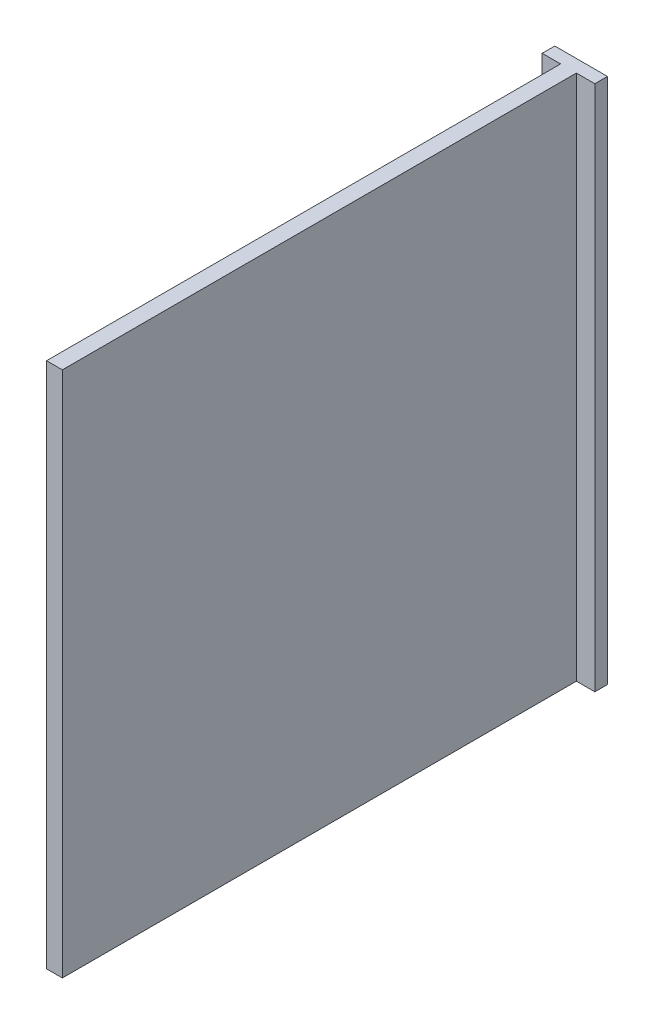
ISO-10303-21;
HEADER;
FILE_DESCRIPTION(('STEP AP214'),'2;1');
FILE_NAME('part.step','',(''),(''),'','','');
FILE_SCHEMA(('AUTOMOTIVE_DESIGN { 1 0 10303 214 1 1 1 1 }'));
ENDSEC;
DATA;
#1=APPLICATION_CONTEXT('core data for automotive mechanical design processes');
#2=APPLICATION_PROTOCOL_DEFINITION('international standard','automotive_design',2000,#1);
#3=PRODUCT_CONTEXT('',#1,'mechanical');
#4=PRODUCT('Part','Part','',(#3));
#5=PRODUCT_RELATED_PRODUCT_CATEGORY('part','',(#4));
#6=PRODUCT_DEFINITION_FORMATION('','',#4);
#7=PRODUCT_DEFINITION_CONTEXT('part definition',#1,'design');
#8=PRODUCT_DEFINITION('design','',#6,#7);
#9=PRODUCT_DEFINITION_SHAPE('','',#8);
#10=(LENGTH_UNIT() NAMED_UNIT(*) SI_UNIT(.MILLI.,.METRE.));
#11=(NAMED_UNIT(*) PLANE_ANGLE_UNIT() SI_UNIT($,.RADIAN.));
#12=(NAMED_UNIT(*) SI_UNIT($,.STERADIAN.) SOLID_ANGLE_UNIT());
#13=UNCERTAINTY_MEASURE_WITH_UNIT(LENGTH_MEASURE(1.E-05),#10,'distance_accuracy_value','');
#14=(GEOMETRIC_REPRESENTATION_CONTEXT(3) GLOBAL_UNCERTAINTY_ASSIGNED_CONTEXT((#13)) GLOBAL_UNIT_ASSIGNED_CONTEXT((#10,
#11,#12)) REPRESENTATION_CONTEXT('',''));
#15=CARTESIAN_POINT('',(0.,0.,0.));
#16=DIRECTION('',(0.,0.,1.));
#17=DIRECTION('',(1.,0.,0.));
#18=AXIS2_PLACEMENT_3D('',#15,#16,#17);
#19=CARTESIAN_POINT('',(1.25,25.,0.));
#20=DIRECTION('',(-1.,0.,0.));
#21=DIRECTION('',(0.,0.,1.));
#22=AXIS2_PLACEMENT_3D('',#19,#20,#21);
#23=PLANE('',#22);
#24=DIRECTION('',(0.,0.,-1.));
#25=VECTOR('',#24,1.);
#26=CARTESIAN_POINT('',(1.25,0.,0.));
#27=LINE('',#26,#25);
#28=CARTESIAN_POINT('',(1.25,0.,0.6));
#29=VERTEX_POINT('',#28);
#30=CARTESIAN_POINT('',(1.25,0.,0.));
#31=VERTEX_POINT('',#30);
#32=EDGE_CURVE('E146',#29,#31,#27,.T.);
#33=ORIENTED_EDGE('',*,*,#32,.T.);
#34=DIRECTION('',(0.,-1.,0.));
#35=VECTOR('',#34,1.);
#36=CARTESIAN_POINT('',(1.25,25.,0.));
#37=LINE('',#36,#35);
#38=CARTESIAN_POINT('',(1.25,25.,0.));
#39=VERTEX_POINT('',#38);
#40=EDGE_CURVE('E11',#39,#31,#37,.T.);
#41=ORIENTED_EDGE('',*,*,#40,.F.);
#42=DIRECTION('',(0.,0.,-1.));
#43=VECTOR('',#42,1.);
#44=CARTESIAN_POINT('',(1.25,25.,0.));
#45=LINE('',#44,#43);
#46=CARTESIAN_POINT('',(1.25,25.,0.6));
#47=VERTEX_POINT('',#46);
#48=EDGE_CURVE('E168',#47,#39,#45,.T.);
#49=ORIENTED_EDGE('',*,*,#48,.F.);
#50=DIRECTION('',(0.,-1.,0.));
#51=VECTOR('',#50,1.);
#52=CARTESIAN_POINT('',(1.25,25.,0.6));
#53=LINE('',#52,#51);
#54=EDGE_CURVE('E142',#47,#29,#53,.T.);
#55=ORIENTED_EDGE('',*,*,#54,.T.);
#56=EDGE_LOOP('',(#33,#41,#49,#55));
#57=FACE_BOUND('',#56,.T.);
#58=ADVANCED_FACE('F45',(#57),#23,.F.);
#59=CARTESIAN_POINT('',(-1.25,25.,0.));
#60=DIRECTION('',(0.,0.,1.));
#61=DIRECTION('',(1.,0.,0.));
#62=AXIS2_PLACEMENT_3D('',#59,#60,#61);
#63=PLANE('',#62);
#64=DIRECTION('',(-1.,0.,0.));
#65=VECTOR('',#64,1.);
#66=CARTESIAN_POINT('',(-1.25,0.,0.));
#67=LINE('',#66,#65);
#68=CARTESIAN_POINT('',(-1.25,0.,0.));
#69=VERTEX_POINT('',#68);
#70=EDGE_CURVE('E150',#31,#69,#67,.T.);
#71=ORIENTED_EDGE('',*,*,#70,.T.);
#72=DIRECTION('',(0.,-1.,0.));
#73=VECTOR('',#72,1.);
#74=CARTESIAN_POINT('',(-1.25,25.,0.));
#75=LINE('',#74,#73);
#76=CARTESIAN_POINT('',(-1.25,25.,0.));
#77=VERTEX_POINT('',#76);
#78=EDGE_CURVE('E54',#77,#69,#75,.T.);
#79=ORIENTED_EDGE('',*,*,#78,.F.);
#80=DIRECTION('',(-1.,0.,0.));
#81=VECTOR('',#80,1.);
#82=CARTESIAN_POINT('',(-1.25,25.,0.));
#83=LINE('',#82,#81);
#84=EDGE_CURVE('E105',#39,#77,#83,.T.);
#85=ORIENTED_EDGE('',*,*,#84,.F.);
#86=ORIENTED_EDGE('',*,*,#40,.T.);
#87=EDGE_LOOP('',(#71,#79,#85,#86));
#88=FACE_BOUND('',#87,.T.);
#89=ADVANCED_FACE('F214',(#88),#63,.F.);
#90=CARTESIAN_POINT('',(-1.25,25.,0.6));
#91=DIRECTION('',(1.,0.,0.));
#92=DIRECTION('',(0.,0.,-1.));
#93=AXIS2_PLACEMENT_3D('',#90,#91,#92);
#94=PLANE('',#93);
#95=DIRECTION('',(0.,0.,1.));
#96=VECTOR('',#95,1.);
#97=CARTESIAN_POINT('',(-1.25,0.,0.6));
#98=LINE('',#97,#96);
#99=CARTESIAN_POINT('',(-1.25,0.,0.6));
#100=VERTEX_POINT('',#99);
#101=EDGE_CURVE('E153',#69,#100,#98,.T.);
#102=ORIENTED_EDGE('',*,*,#101,.T.);
#103=DIRECTION('',(0.,-1.,0.));
#104=VECTOR('',#103,1.);
#105=CARTESIAN_POINT('',(-1.25,25.,0.6));
#106=LINE('',#105,#104);
#107=CARTESIAN_POINT('',(-1.25,25.,0.6));
#108=VERTEX_POINT('',#107);
#109=EDGE_CURVE('E179',#108,#100,#106,.T.);
#110=ORIENTED_EDGE('',*,*,#109,.F.);
#111=DIRECTION('',(0.,0.,1.));
#112=VECTOR('',#111,1.);
#113=CARTESIAN_POINT('',(-1.25,25.,0.6));
#114=LINE('',#113,#112);
#115=EDGE_CURVE('E189',#77,#108,#114,.T.);
#116=ORIENTED_EDGE('',*,*,#115,.F.);
#117=ORIENTED_EDGE('',*,*,#78,.T.);
#118=EDGE_LOOP('',(#102,#110,#116,#117));
#119=FACE_BOUND('',#118,.T.);
#120=ADVANCED_FACE('F187',(#119),#94,.F.);
#121=CARTESIAN_POINT('',(-1.25,25.,0.6));
#122=DIRECTION('',(0.,0.,-1.));
#123=DIRECTION('',(-1.,0.,0.));
#124=AXIS2_PLACEMENT_3D('',#121,#122,#123);
#125=PLANE('',#124);
#126=DIRECTION('',(1.,0.,0.));
#127=VECTOR('',#126,1.);
#128=CARTESIAN_POINT('',(-1.25,0.,0.6));
#129=LINE('',#128,#127);
#130=CARTESIAN_POINT('',(-0.375000000000003,0.,0.6));
#131=VERTEX_POINT('',#130);
#132=EDGE_CURVE('E156',#100,#131,#129,.T.);
#133=ORIENTED_EDGE('',*,*,#132,.T.);
#134=DIRECTION('',(0.,-1.,0.));
#135=VECTOR('',#134,1.);
#136=CARTESIAN_POINT('',(-0.375000000000003,25.,0.6));
#137=LINE('',#136,#135);
#138=CARTESIAN_POINT('',(-0.375000000000003,25.,0.6));
#139=VERTEX_POINT('',#138);
#140=EDGE_CURVE('E175',#139,#131,#137,.T.);
#141=ORIENTED_EDGE('',*,*,#140,.F.);
#142=DIRECTION('',(1.,0.,0.));
#143=VECTOR('',#142,1.);
#144=CARTESIAN_POINT('',(-1.25,25.,0.6));
#145=LINE('',#144,#143);
#146=EDGE_CURVE('E202',#108,#139,#145,.T.);
#147=ORIENTED_EDGE('',*,*,#146,.F.);
#148=ORIENTED_EDGE('',*,*,#109,.T.);
#149=EDGE_LOOP('',(#133,#141,#147,#148));
#150=FACE_BOUND('',#149,.T.);
#151=ADVANCED_FACE('F197',(#150),#125,.F.);
#152=CARTESIAN_POINT('',(-0.375000000000003,25.,0.6));
#153=DIRECTION('',(1.,0.,0.));
#154=DIRECTION('',(0.,0.,-1.));
#155=AXIS2_PLACEMENT_3D('',#152,#153,#154);
#156=PLANE('',#155);
#157=DIRECTION('',(0.,0.,1.));
#158=VECTOR('',#157,1.);
#159=CARTESIAN_POINT('',(-0.375000000000003,0.,0.6));
#160=LINE('',#159,#158);
#161=CARTESIAN_POINT('',(-0.375,0.,25.));
#162=VERTEX_POINT('',#161);
#163=EDGE_CURVE('E159',#131,#162,#160,.T.);
#164=ORIENTED_EDGE('',*,*,#163,.T.);
#165=DIRECTION('',(0.,-1.,0.));
#166=VECTOR('',#165,1.);
#167=CARTESIAN_POINT('',(-0.375,25.,25.));
#168=LINE('',#167,#166);
#169=CARTESIAN_POINT('',(-0.375,25.,25.));
#170=VERTEX_POINT('',#169);
#171=EDGE_CURVE('E135',#170,#162,#168,.T.);
#172=ORIENTED_EDGE('',*,*,#171,.F.);
#173=DIRECTION('',(0.,0.,1.));
#174=VECTOR('',#173,1.);
#175=CARTESIAN_POINT('',(-0.375000000000003,25.,0.6));
#176=LINE('',#175,#174);
#177=EDGE_CURVE('E124',#139,#170,#176,.T.);
#178=ORIENTED_EDGE('',*,*,#177,.F.);
#179=ORIENTED_EDGE('',*,*,#140,.T.);
#180=EDGE_LOOP('',(#164,#172,#178,#179));
#181=FACE_BOUND('',#180,.T.);
#182=ADVANCED_FACE('F200',(#181),#156,.F.);
#183=CARTESIAN_POINT('',(-0.375,25.,25.));
#184=DIRECTION('',(0.,0.,-1.));
#185=DIRECTION('',(-1.,0.,0.));
#186=AXIS2_PLACEMENT_3D('',#183,#184,#185);
#187=PLANE('',#186);
#188=DIRECTION('',(1.,0.,0.));
#189=VECTOR('',#188,1.);
#190=CARTESIAN_POINT('',(-0.375,0.,25.));
#191=LINE('',#190,#189);
#192=CARTESIAN_POINT('',(0.375,0.,25.));
#193=VERTEX_POINT('',#192);
#194=EDGE_CURVE('E133',#162,#193,#191,.T.);
#195=ORIENTED_EDGE('',*,*,#194,.T.);
#196=DIRECTION('',(0.,-1.,0.));
#197=VECTOR('',#196,1.);
#198=CARTESIAN_POINT('',(0.375,25.,25.));
#199=LINE('',#198,#197);
#200=CARTESIAN_POINT('',(0.375,25.,25.));
#201=VERTEX_POINT('',#200);
#202=EDGE_CURVE('E130',#201,#193,#199,.T.);
#203=ORIENTED_EDGE('',*,*,#202,.F.);
#204=DIRECTION('',(1.,0.,0.));
#205=VECTOR('',#204,1.);
#206=CARTESIAN_POINT('',(-0.375,25.,25.));
#207=LINE('',#206,#205);
#208=EDGE_CURVE('E118',#170,#201,#207,.T.);
#209=ORIENTED_EDGE('',*,*,#208,.F.);
#210=ORIENTED_EDGE('',*,*,#171,.T.);
#211=EDGE_LOOP('',(#195,#203,#209,#210));
#212=FACE_BOUND('',#211,.T.);
#213=ADVANCED_FACE('F131',(#212),#187,.F.);
#214=CARTESIAN_POINT('',(0.375,25.,25.));
#215=DIRECTION('',(-1.,0.,0.));
#216=DIRECTION('',(0.,0.,1.));
#217=AXIS2_PLACEMENT_3D('',#214,#215,#216);
#218=PLANE('',#217);
#219=DIRECTION('',(0.,0.,-1.));
#220=VECTOR('',#219,1.);
#221=CARTESIAN_POINT('',(0.375,0.,25.));
#222=LINE('',#221,#220);
#223=CARTESIAN_POINT('',(0.375,0.,0.6));
#224=VERTEX_POINT('',#223);
#225=EDGE_CURVE('E91',#193,#224,#222,.T.);
#226=ORIENTED_EDGE('',*,*,#225,.T.);
#227=DIRECTION('',(0.,-1.,0.));
#228=VECTOR('',#227,1.);
#229=CARTESIAN_POINT('',(0.375,25.,0.6));
#230=LINE('',#229,#228);
#231=CARTESIAN_POINT('',(0.375,25.,0.6));
#232=VERTEX_POINT('',#231);
#233=EDGE_CURVE('E136',#232,#224,#230,.T.);
#234=ORIENTED_EDGE('',*,*,#233,.F.);
#235=DIRECTION('',(0.,0.,-1.));
#236=VECTOR('',#235,1.);
#237=CARTESIAN_POINT('',(0.375,25.,25.));
#238=LINE('',#237,#236);
#239=EDGE_CURVE('E122',#201,#232,#238,.T.);
#240=ORIENTED_EDGE('',*,*,#239,.F.);
#241=ORIENTED_EDGE('',*,*,#202,.T.);
#242=EDGE_LOOP('',(#226,#234,#240,#241));
#243=FACE_BOUND('',#242,.T.);
#244=ADVANCED_FACE('F138',(#243),#218,.F.);
#245=CARTESIAN_POINT('',(1.25,25.,0.6));
#246=DIRECTION('',(0.,0.,-1.));
#247=DIRECTION('',(-1.,0.,0.));
#248=AXIS2_PLACEMENT_3D('',#245,#246,#247);
#249=PLANE('',#248);
#250=DIRECTION('',(1.,0.,0.));
#251=VECTOR('',#250,1.);
#252=CARTESIAN_POINT('',(1.25,0.,0.6));
#253=LINE('',#252,#251);
#254=EDGE_CURVE('E97',#224,#29,#253,.T.);
#255=ORIENTED_EDGE('',*,*,#254,.T.);
#256=ORIENTED_EDGE('',*,*,#54,.F.);
#257=DIRECTION('',(1.,0.,0.));
#258=VECTOR('',#257,1.);
#259=CARTESIAN_POINT('',(1.25,25.,0.6));
#260=LINE('',#259,#258);
#261=EDGE_CURVE('E62',#232,#47,#260,.T.);
#262=ORIENTED_EDGE('',*,*,#261,.F.);
#263=ORIENTED_EDGE('',*,*,#233,.T.);
#264=EDGE_LOOP('',(#255,#256,#262,#263));
#265=FACE_BOUND('',#264,.T.);
#266=ADVANCED_FACE('F230',(#265),#249,.F.);
#267=CARTESIAN_POINT('',(0.,25.,0.));
#268=DIRECTION('',(0.,-1.,0.));
#269=DIRECTION('',(0.,0.,-1.));
#270=AXIS2_PLACEMENT_3D('',#267,#268,#269);
#271=PLANE('',#270);
#272=ORIENTED_EDGE('',*,*,#48,.T.);
#273=ORIENTED_EDGE('',*,*,#84,.T.);
#274=ORIENTED_EDGE('',*,*,#115,.T.);
#275=ORIENTED_EDGE('',*,*,#146,.T.);
#276=ORIENTED_EDGE('',*,*,#177,.T.);
#277=ORIENTED_EDGE('',*,*,#208,.T.);
#278=ORIENTED_EDGE('',*,*,#239,.T.);
#279=ORIENTED_EDGE('',*,*,#261,.T.);
#280=EDGE_LOOP('',(#272,#273,#274,#275,#276,#277,#278,#279));
#281=FACE_BOUND('',#280,.T.);
#282=ADVANCED_FACE('F120',(#281),#271,.F.);
#283=CARTESIAN_POINT('',(0.,0.,0.));
#284=DIRECTION('',(0.,-1.,0.));
#285=DIRECTION('',(0.,0.,-1.));
#286=AXIS2_PLACEMENT_3D('',#283,#284,#285);
#287=PLANE('',#286);
#288=ORIENTED_EDGE('',*,*,#32,.F.);
#289=ORIENTED_EDGE('',*,*,#254,.F.);
#290=ORIENTED_EDGE('',*,*,#225,.F.);
#291=ORIENTED_EDGE('',*,*,#194,.F.);
#292=ORIENTED_EDGE('',*,*,#163,.F.);
#293=ORIENTED_EDGE('',*,*,#132,.F.);
#294=ORIENTED_EDGE('',*,*,#101,.F.);
#295=ORIENTED_EDGE('',*,*,#70,.F.);
#296=EDGE_LOOP('',(#288,#289,#290,#291,#292,#293,#294,#295));
#297=FACE_BOUND('',#296,.T.);
#298=ADVANCED_FACE('F193',(#297),#287,.T.);
#299=CLOSED_SHELL('',(#58,#89,#120,#151,#182,#213,#244,#266,#282,#298));
#300=MANIFOLD_SOLID_BREP('B2',#299);
#301=ADVANCED_BREP_SHAPE_REPRESENTATION('',(#18,#300),#14);
#302=SHAPE_DEFINITION_REPRESENTATION(#9,#301);
ENDSEC;
END-ISO-10303-21;
